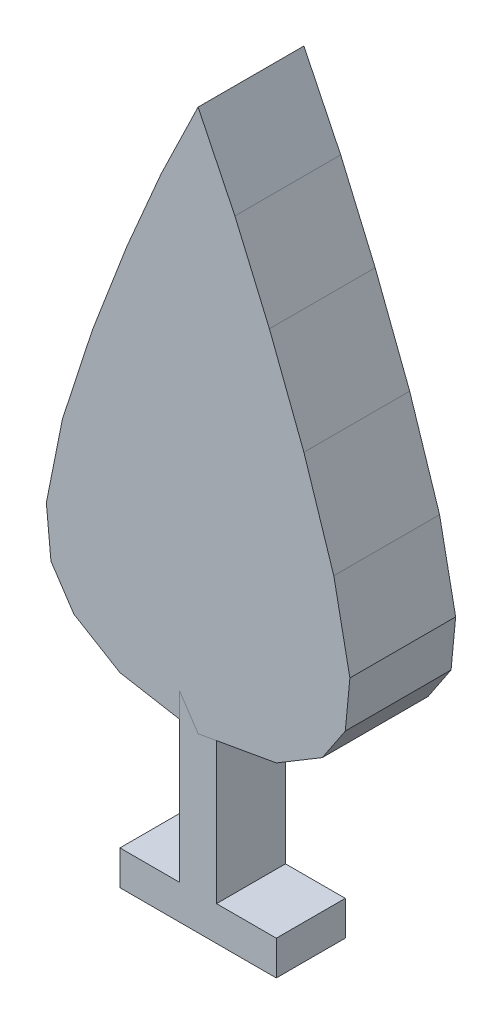
ISO-10303-21;
HEADER;
FILE_DESCRIPTION(('STEP AP214'),'2;1');
FILE_NAME('part.step','',(''),(''),'','','');
FILE_SCHEMA(('AUTOMOTIVE_DESIGN { 1 0 10303 214 1 1 1 1 }'));
ENDSEC;
DATA;
#1=APPLICATION_CONTEXT('core data for automotive mechanical design processes');
#2=APPLICATION_PROTOCOL_DEFINITION('international standard','automotive_design',2000,#1);
#3=PRODUCT_CONTEXT('',#1,'mechanical');
#4=PRODUCT('Part','Part','',(#3));
#5=PRODUCT_RELATED_PRODUCT_CATEGORY('part','',(#4));
#6=PRODUCT_DEFINITION_FORMATION('','',#4);
#7=PRODUCT_DEFINITION_CONTEXT('part definition',#1,'design');
#8=PRODUCT_DEFINITION('design','',#6,#7);
#9=PRODUCT_DEFINITION_SHAPE('','',#8);
#10=(LENGTH_UNIT() NAMED_UNIT(*) SI_UNIT(.MILLI.,.METRE.));
#11=(NAMED_UNIT(*) PLANE_ANGLE_UNIT() SI_UNIT($,.RADIAN.));
#12=(NAMED_UNIT(*) SI_UNIT($,.STERADIAN.) SOLID_ANGLE_UNIT());
#13=UNCERTAINTY_MEASURE_WITH_UNIT(LENGTH_MEASURE(1.E-05),#10,'distance_accuracy_value','');
#14=(GEOMETRIC_REPRESENTATION_CONTEXT(3) GLOBAL_UNCERTAINTY_ASSIGNED_CONTEXT((#13)) GLOBAL_UNIT_ASSIGNED_CONTEXT((#10,
#11,#12)) REPRESENTATION_CONTEXT('',''));
#15=CARTESIAN_POINT('',(0.,0.,0.));
#16=DIRECTION('',(0.,0.,1.));
#17=DIRECTION('',(1.,0.,0.));
#18=AXIS2_PLACEMENT_3D('',#15,#16,#17);
#19=CARTESIAN_POINT('',(-16.,172.,-46.));
#20=DIRECTION('',(-0.8998141071962,0.436273506519369,0.));
#21=DIRECTION('',(-0.436273506519369,-0.8998141071962,0.));
#22=AXIS2_PLACEMENT_3D('',#19,#20,#21);
#23=PLANE('',#22);
#24=DIRECTION('',(-0.436273506519369,-0.899814107196199,0.));
#25=VECTOR('',#24,1.);
#26=CARTESIAN_POINT('',(-16.,172.,0.));
#27=LINE('',#26,#25);
#28=CARTESIAN_POINT('',(0.,205.,0.));
#29=VERTEX_POINT('',#28);
#30=CARTESIAN_POINT('',(-16.,172.,0.));
#31=VERTEX_POINT('',#30);
#32=EDGE_CURVE('E210',#29,#31,#27,.T.);
#33=ORIENTED_EDGE('',*,*,#32,.F.);
#34=DIRECTION('',(0.,0.,1.));
#35=VECTOR('',#34,1.);
#36=CARTESIAN_POINT('',(0.,205.,-46.));
#37=LINE('',#36,#35);
#38=CARTESIAN_POINT('',(0.,205.,-46.));
#39=VERTEX_POINT('',#38);
#40=EDGE_CURVE('E12',#39,#29,#37,.T.);
#41=ORIENTED_EDGE('',*,*,#40,.F.);
#42=DIRECTION('',(-0.436273506519369,-0.899814107196199,0.));
#43=VECTOR('',#42,1.);
#44=CARTESIAN_POINT('',(-16.,172.,-46.));
#45=LINE('',#44,#43);
#46=CARTESIAN_POINT('',(-16.,172.,-46.));
#47=VERTEX_POINT('',#46);
#48=EDGE_CURVE('E260',#39,#47,#45,.T.);
#49=ORIENTED_EDGE('',*,*,#48,.T.);
#50=DIRECTION('',(0.,0.,1.));
#51=VECTOR('',#50,1.);
#52=CARTESIAN_POINT('',(-16.,172.,-46.));
#53=LINE('',#52,#51);
#54=EDGE_CURVE('E56',#47,#31,#53,.T.);
#55=ORIENTED_EDGE('',*,*,#54,.T.);
#56=EDGE_LOOP('',(#33,#41,#49,#55));
#57=FACE_BOUND('',#56,.T.);
#58=ADVANCED_FACE('F53',(#57),#23,.T.);
#59=CARTESIAN_POINT('',(0.,205.,-46.));
#60=DIRECTION('',(0.8998141071962,0.436273506519369,0.));
#61=DIRECTION('',(-0.436273506519369,0.8998141071962,0.));
#62=AXIS2_PLACEMENT_3D('',#59,#60,#61);
#63=PLANE('',#62);
#64=DIRECTION('',(-0.436273506519369,0.899814107196199,0.));
#65=VECTOR('',#64,1.);
#66=CARTESIAN_POINT('',(0.,205.,0.));
#67=LINE('',#66,#65);
#68=CARTESIAN_POINT('',(16.,172.,0.));
#69=VERTEX_POINT('',#68);
#70=EDGE_CURVE('E258',#69,#29,#67,.T.);
#71=ORIENTED_EDGE('',*,*,#70,.F.);
#72=DIRECTION('',(0.,0.,1.));
#73=VECTOR('',#72,1.);
#74=CARTESIAN_POINT('',(16.,172.,-46.));
#75=LINE('',#74,#73);
#76=CARTESIAN_POINT('',(16.,172.,-46.));
#77=VERTEX_POINT('',#76);
#78=EDGE_CURVE('E62',#77,#69,#75,.T.);
#79=ORIENTED_EDGE('',*,*,#78,.F.);
#80=DIRECTION('',(-0.436273506519369,0.899814107196199,0.));
#81=VECTOR('',#80,1.);
#82=CARTESIAN_POINT('',(0.,205.,-46.));
#83=LINE('',#82,#81);
#84=EDGE_CURVE('E200',#77,#39,#83,.T.);
#85=ORIENTED_EDGE('',*,*,#84,.T.);
#86=ORIENTED_EDGE('',*,*,#40,.T.);
#87=EDGE_LOOP('',(#71,#79,#85,#86));
#88=FACE_BOUND('',#87,.T.);
#89=ADVANCED_FACE('F292',(#88),#63,.T.);
#90=CARTESIAN_POINT('',(16.,172.,-46.));
#91=DIRECTION('',(0.919145030018058,0.393919298579168,0.));
#92=DIRECTION('',(-0.393919298579168,0.919145030018058,0.));
#93=AXIS2_PLACEMENT_3D('',#90,#91,#92);
#94=PLANE('',#93);
#95=DIRECTION('',(-0.393919298579168,0.919145030018058,0.));
#96=VECTOR('',#95,1.);
#97=CARTESIAN_POINT('',(16.,172.,0.));
#98=LINE('',#97,#96);
#99=CARTESIAN_POINT('',(31.,137.,0.));
#100=VERTEX_POINT('',#99);
#101=EDGE_CURVE('E187',#100,#69,#98,.T.);
#102=ORIENTED_EDGE('',*,*,#101,.F.);
#103=DIRECTION('',(0.,0.,1.));
#104=VECTOR('',#103,1.);
#105=CARTESIAN_POINT('',(31.,137.,-46.));
#106=LINE('',#105,#104);
#107=CARTESIAN_POINT('',(31.,137.,-46.));
#108=VERTEX_POINT('',#107);
#109=EDGE_CURVE('E182',#108,#100,#106,.T.);
#110=ORIENTED_EDGE('',*,*,#109,.F.);
#111=DIRECTION('',(-0.393919298579168,0.919145030018058,0.));
#112=VECTOR('',#111,1.);
#113=CARTESIAN_POINT('',(16.,172.,-46.));
#114=LINE('',#113,#112);
#115=EDGE_CURVE('E185',#108,#77,#114,.T.);
#116=ORIENTED_EDGE('',*,*,#115,.T.);
#117=ORIENTED_EDGE('',*,*,#78,.T.);
#118=EDGE_LOOP('',(#102,#110,#116,#117));
#119=FACE_BOUND('',#118,.T.);
#120=ADVANCED_FACE('F184',(#119),#94,.T.);
#121=CARTESIAN_POINT('',(31.,137.,-46.));
#122=DIRECTION('',(0.93334560620306,0.358979079308869,0.));
#123=DIRECTION('',(-0.358979079308869,0.93334560620306,0.));
#124=AXIS2_PLACEMENT_3D('',#121,#122,#123);
#125=PLANE('',#124);
#126=DIRECTION('',(-0.358979079308869,0.93334560620306,0.));
#127=VECTOR('',#126,1.);
#128=CARTESIAN_POINT('',(31.,137.,0.));
#129=LINE('',#128,#127);
#130=CARTESIAN_POINT('',(46.,98.,0.));
#131=VERTEX_POINT('',#130);
#132=EDGE_CURVE('E255',#131,#100,#129,.T.);
#133=ORIENTED_EDGE('',*,*,#132,.F.);
#134=DIRECTION('',(0.,0.,1.));
#135=VECTOR('',#134,1.);
#136=CARTESIAN_POINT('',(46.,98.,-46.));
#137=LINE('',#136,#135);
#138=CARTESIAN_POINT('',(46.,98.,-46.));
#139=VERTEX_POINT('',#138);
#140=EDGE_CURVE('E192',#139,#131,#137,.T.);
#141=ORIENTED_EDGE('',*,*,#140,.F.);
#142=DIRECTION('',(-0.358979079308869,0.93334560620306,0.));
#143=VECTOR('',#142,1.);
#144=CARTESIAN_POINT('',(31.,137.,-46.));
#145=LINE('',#144,#143);
#146=EDGE_CURVE('E198',#139,#108,#145,.T.);
#147=ORIENTED_EDGE('',*,*,#146,.T.);
#148=ORIENTED_EDGE('',*,*,#109,.T.);
#149=EDGE_LOOP('',(#133,#141,#147,#148));
#150=FACE_BOUND('',#149,.T.);
#151=ADVANCED_FACE('F202',(#150),#125,.T.);
#152=CARTESIAN_POINT('',(46.,98.,-46.));
#153=DIRECTION('',(0.951034068730948,0.309086072337558,0.));
#154=DIRECTION('',(-0.309086072337558,0.951034068730948,0.));
#155=AXIS2_PLACEMENT_3D('',#152,#153,#154);
#156=PLANE('',#155);
#157=DIRECTION('',(-0.309086072337558,0.951034068730948,0.));
#158=VECTOR('',#157,1.);
#159=CARTESIAN_POINT('',(46.,98.,0.));
#160=LINE('',#159,#158);
#161=CARTESIAN_POINT('',(59.,58.,0.));
#162=VERTEX_POINT('',#161);
#163=EDGE_CURVE('E252',#162,#131,#160,.T.);
#164=ORIENTED_EDGE('',*,*,#163,.F.);
#165=DIRECTION('',(0.,0.,1.));
#166=VECTOR('',#165,1.);
#167=CARTESIAN_POINT('',(59.,58.,-46.));
#168=LINE('',#167,#166);
#169=CARTESIAN_POINT('',(59.,58.,-46.));
#170=VERTEX_POINT('',#169);
#171=EDGE_CURVE('E264',#170,#162,#168,.T.);
#172=ORIENTED_EDGE('',*,*,#171,.F.);
#173=DIRECTION('',(-0.309086072337558,0.951034068730948,0.));
#174=VECTOR('',#173,1.);
#175=CARTESIAN_POINT('',(46.,98.,-46.));
#176=LINE('',#175,#174);
#177=EDGE_CURVE('E203',#170,#139,#176,.T.);
#178=ORIENTED_EDGE('',*,*,#177,.T.);
#179=ORIENTED_EDGE('',*,*,#140,.T.);
#180=EDGE_LOOP('',(#164,#172,#178,#179));
#181=FACE_BOUND('',#180,.T.);
#182=ADVANCED_FACE('F305',(#181),#156,.T.);
#183=CARTESIAN_POINT('',(59.,58.,-46.));
#184=DIRECTION('',(0.98058067569092,0.196116135138184,0.));
#185=DIRECTION('',(-0.196116135138184,0.98058067569092,0.));
#186=AXIS2_PLACEMENT_3D('',#183,#184,#185);
#187=PLANE('',#186);
#188=DIRECTION('',(-0.196116135138184,0.98058067569092,0.));
#189=VECTOR('',#188,1.);
#190=CARTESIAN_POINT('',(59.,58.,0.));
#191=LINE('',#190,#189);
#192=CARTESIAN_POINT('',(66.,23.,0.));
#193=VERTEX_POINT('',#192);
#194=EDGE_CURVE('E249',#193,#162,#191,.T.);
#195=ORIENTED_EDGE('',*,*,#194,.F.);
#196=DIRECTION('',(0.,0.,1.));
#197=VECTOR('',#196,1.);
#198=CARTESIAN_POINT('',(66.,23.,-46.));
#199=LINE('',#198,#197);
#200=CARTESIAN_POINT('',(66.,23.,-46.));
#201=VERTEX_POINT('',#200);
#202=EDGE_CURVE('E266',#201,#193,#199,.T.);
#203=ORIENTED_EDGE('',*,*,#202,.F.);
#204=DIRECTION('',(-0.196116135138184,0.98058067569092,0.));
#205=VECTOR('',#204,1.);
#206=CARTESIAN_POINT('',(59.,58.,-46.));
#207=LINE('',#206,#205);
#208=EDGE_CURVE('E205',#201,#170,#207,.T.);
#209=ORIENTED_EDGE('',*,*,#208,.T.);
#210=ORIENTED_EDGE('',*,*,#171,.T.);
#211=EDGE_LOOP('',(#195,#203,#209,#210));
#212=FACE_BOUND('',#211,.T.);
#213=ADVANCED_FACE('F308',(#212),#187,.T.);
#214=CARTESIAN_POINT('',(66.,23.,-46.));
#215=DIRECTION('',(0.995495472593952,-0.0948090926279955,0.));
#216=DIRECTION('',(0.0948090926279956,0.995495472593952,0.));
#217=AXIS2_PLACEMENT_3D('',#214,#215,#216);
#218=PLANE('',#217);
#219=DIRECTION('',(0.0948090926279955,0.995495472593952,0.));
#220=VECTOR('',#219,1.);
#221=CARTESIAN_POINT('',(66.,23.,0.));
#222=LINE('',#221,#220);
#223=CARTESIAN_POINT('',(64.,2.,0.));
#224=VERTEX_POINT('',#223);
#225=EDGE_CURVE('E246',#224,#193,#222,.T.);
#226=ORIENTED_EDGE('',*,*,#225,.F.);
#227=DIRECTION('',(0.,0.,1.));
#228=VECTOR('',#227,1.);
#229=CARTESIAN_POINT('',(64.,2.,-46.));
#230=LINE('',#229,#228);
#231=CARTESIAN_POINT('',(64.,2.,-46.));
#232=VERTEX_POINT('',#231);
#233=EDGE_CURVE('E268',#232,#224,#230,.T.);
#234=ORIENTED_EDGE('',*,*,#233,.F.);
#235=DIRECTION('',(0.0948090926279955,0.995495472593952,0.));
#236=VECTOR('',#235,1.);
#237=CARTESIAN_POINT('',(66.,23.,-46.));
#238=LINE('',#237,#236);
#239=EDGE_CURVE('E516',#232,#201,#238,.T.);
#240=ORIENTED_EDGE('',*,*,#239,.T.);
#241=ORIENTED_EDGE('',*,*,#202,.T.);
#242=EDGE_LOOP('',(#226,#234,#240,#241));
#243=FACE_BOUND('',#242,.T.);
#244=ADVANCED_FACE('F312',(#243),#218,.T.);
#245=CARTESIAN_POINT('',(64.,2.,-46.));
#246=DIRECTION('',(0.832050294337844,-0.554700196225229,0.));
#247=DIRECTION('',(0.554700196225229,0.832050294337843,0.));
#248=AXIS2_PLACEMENT_3D('',#245,#246,#247);
#249=PLANE('',#248);
#250=DIRECTION('',(0.554700196225229,0.832050294337843,0.));
#251=VECTOR('',#250,1.);
#252=CARTESIAN_POINT('',(64.,2.,0.));
#253=LINE('',#252,#251);
#254=CARTESIAN_POINT('',(54.,-13.,0.));
#255=VERTEX_POINT('',#254);
#256=EDGE_CURVE('E243',#255,#224,#253,.T.);
#257=ORIENTED_EDGE('',*,*,#256,.F.);
#258=DIRECTION('',(0.,0.,1.));
#259=VECTOR('',#258,1.);
#260=CARTESIAN_POINT('',(54.,-13.,-46.));
#261=LINE('',#260,#259);
#262=CARTESIAN_POINT('',(54.,-13.,-46.));
#263=VERTEX_POINT('',#262);
#264=EDGE_CURVE('E270',#263,#255,#261,.T.);
#265=ORIENTED_EDGE('',*,*,#264,.F.);
#266=DIRECTION('',(0.554700196225229,0.832050294337843,0.));
#267=VECTOR('',#266,1.);
#268=CARTESIAN_POINT('',(64.,2.,-46.));
#269=LINE('',#268,#267);
#270=EDGE_CURVE('E520',#263,#232,#269,.T.);
#271=ORIENTED_EDGE('',*,*,#270,.T.);
#272=ORIENTED_EDGE('',*,*,#233,.T.);
#273=EDGE_LOOP('',(#257,#265,#271,#272));
#274=FACE_BOUND('',#273,.T.);
#275=ADVANCED_FACE('F316',(#274),#249,.T.);
#276=CARTESIAN_POINT('',(54.,-13.,-46.));
#277=DIRECTION('',(0.514495755427527,-0.857492925712544,0.));
#278=DIRECTION('',(0.857492925712544,0.514495755427527,0.));
#279=AXIS2_PLACEMENT_3D('',#276,#277,#278);
#280=PLANE('',#279);
#281=DIRECTION('',(0.857492925712544,0.514495755427527,0.));
#282=VECTOR('',#281,1.);
#283=CARTESIAN_POINT('',(54.,-13.,0.));
#284=LINE('',#283,#282);
#285=CARTESIAN_POINT('',(34.,-25.,0.));
#286=VERTEX_POINT('',#285);
#287=EDGE_CURVE('E240',#286,#255,#284,.T.);
#288=ORIENTED_EDGE('',*,*,#287,.F.);
#289=DIRECTION('',(0.,0.,1.));
#290=VECTOR('',#289,1.);
#291=CARTESIAN_POINT('',(34.,-25.,-46.));
#292=LINE('',#291,#290);
#293=CARTESIAN_POINT('',(34.,-25.,-46.));
#294=VERTEX_POINT('',#293);
#295=EDGE_CURVE('E272',#294,#286,#292,.T.);
#296=ORIENTED_EDGE('',*,*,#295,.F.);
#297=DIRECTION('',(0.857492925712544,0.514495755427527,0.));
#298=VECTOR('',#297,1.);
#299=CARTESIAN_POINT('',(54.,-13.,-46.));
#300=LINE('',#299,#298);
#301=EDGE_CURVE('E509',#294,#263,#300,.T.);
#302=ORIENTED_EDGE('',*,*,#301,.T.);
#303=ORIENTED_EDGE('',*,*,#264,.T.);
#304=EDGE_LOOP('',(#288,#296,#302,#303));
#305=FACE_BOUND('',#304,.T.);
#306=ADVANCED_FACE('F320',(#305),#280,.T.);
#307=CARTESIAN_POINT('',(34.,-25.,-46.));
#308=DIRECTION('',(0.173785333909048,-0.984783558817937,0.));
#309=DIRECTION('',(0.984783558817937,0.173785333909048,0.));
#310=AXIS2_PLACEMENT_3D('',#307,#308,#309);
#311=PLANE('',#310);
#312=DIRECTION('',(0.984783558817937,0.173785333909048,0.));
#313=VECTOR('',#312,1.);
#314=CARTESIAN_POINT('',(34.,-25.,0.));
#315=LINE('',#314,#313);
#316=CARTESIAN_POINT('',(0.,-31.,0.));
#317=VERTEX_POINT('',#316);
#318=EDGE_CURVE('E237',#317,#286,#315,.T.);
#319=ORIENTED_EDGE('',*,*,#318,.F.);
#320=DIRECTION('',(0.,0.,1.));
#321=VECTOR('',#320,1.);
#322=CARTESIAN_POINT('',(0.,-31.,-46.));
#323=LINE('',#322,#321);
#324=CARTESIAN_POINT('',(0.,-31.,-46.));
#325=VERTEX_POINT('',#324);
#326=EDGE_CURVE('E274',#325,#317,#323,.T.);
#327=ORIENTED_EDGE('',*,*,#326,.F.);
#328=DIRECTION('',(0.984783558817937,0.173785333909048,0.));
#329=VECTOR('',#328,1.);
#330=CARTESIAN_POINT('',(34.,-25.,-46.));
#331=LINE('',#330,#329);
#332=EDGE_CURVE('E505',#325,#294,#331,.T.);
#333=ORIENTED_EDGE('',*,*,#332,.T.);
#334=ORIENTED_EDGE('',*,*,#295,.T.);
#335=EDGE_LOOP('',(#319,#327,#333,#334));
#336=FACE_BOUND('',#335,.T.);
#337=ADVANCED_FACE('F324',(#336),#311,.T.);
#338=CARTESIAN_POINT('',(0.,-31.,-46.));
#339=DIRECTION('',(-0.173785333909048,-0.984783558817937,0.));
#340=DIRECTION('',(0.984783558817937,-0.173785333909048,0.));
#341=AXIS2_PLACEMENT_3D('',#338,#339,#340);
#342=PLANE('',#341);
#343=DIRECTION('',(0.984783558817937,-0.173785333909048,0.));
#344=VECTOR('',#343,1.);
#345=CARTESIAN_POINT('',(0.,-31.,0.));
#346=LINE('',#345,#344);
#347=CARTESIAN_POINT('',(-34.,-25.,0.));
#348=VERTEX_POINT('',#347);
#349=EDGE_CURVE('E234',#348,#317,#346,.T.);
#350=ORIENTED_EDGE('',*,*,#349,.F.);
#351=DIRECTION('',(0.,0.,1.));
#352=VECTOR('',#351,1.);
#353=CARTESIAN_POINT('',(-34.,-25.,-46.));
#354=LINE('',#353,#352);
#355=CARTESIAN_POINT('',(-34.,-25.,-46.));
#356=VERTEX_POINT('',#355);
#357=EDGE_CURVE('E276',#356,#348,#354,.T.);
#358=ORIENTED_EDGE('',*,*,#357,.F.);
#359=DIRECTION('',(0.984783558817937,-0.173785333909048,0.));
#360=VECTOR('',#359,1.);
#361=CARTESIAN_POINT('',(0.,-31.,-46.));
#362=LINE('',#361,#360);
#363=EDGE_CURVE('E526',#356,#325,#362,.T.);
#364=ORIENTED_EDGE('',*,*,#363,.T.);
#365=ORIENTED_EDGE('',*,*,#326,.T.);
#366=EDGE_LOOP('',(#350,#358,#364,#365));
#367=FACE_BOUND('',#366,.T.);
#368=ADVANCED_FACE('F328',(#367),#342,.T.);
#369=CARTESIAN_POINT('',(-34.,-25.,-46.));
#370=DIRECTION('',(-0.514495755427527,-0.857492925712544,0.));
#371=DIRECTION('',(0.857492925712544,-0.514495755427527,0.));
#372=AXIS2_PLACEMENT_3D('',#369,#370,#371);
#373=PLANE('',#372);
#374=DIRECTION('',(0.857492925712544,-0.514495755427527,0.));
#375=VECTOR('',#374,1.);
#376=CARTESIAN_POINT('',(-34.,-25.,0.));
#377=LINE('',#376,#375);
#378=CARTESIAN_POINT('',(-54.,-13.,0.));
#379=VERTEX_POINT('',#378);
#380=EDGE_CURVE('E231',#379,#348,#377,.T.);
#381=ORIENTED_EDGE('',*,*,#380,.F.);
#382=DIRECTION('',(0.,0.,1.));
#383=VECTOR('',#382,1.);
#384=CARTESIAN_POINT('',(-54.,-13.,-46.));
#385=LINE('',#384,#383);
#386=CARTESIAN_POINT('',(-54.,-13.,-46.));
#387=VERTEX_POINT('',#386);
#388=EDGE_CURVE('E278',#387,#379,#385,.T.);
#389=ORIENTED_EDGE('',*,*,#388,.F.);
#390=DIRECTION('',(0.857492925712544,-0.514495755427527,0.));
#391=VECTOR('',#390,1.);
#392=CARTESIAN_POINT('',(-34.,-25.,-46.));
#393=LINE('',#392,#391);
#394=EDGE_CURVE('E498',#387,#356,#393,.T.);
#395=ORIENTED_EDGE('',*,*,#394,.T.);
#396=ORIENTED_EDGE('',*,*,#357,.T.);
#397=EDGE_LOOP('',(#381,#389,#395,#396));
#398=FACE_BOUND('',#397,.T.);
#399=ADVANCED_FACE('F332',(#398),#373,.T.);
#400=CARTESIAN_POINT('',(-54.,-13.,-46.));
#401=DIRECTION('',(-0.832050294337844,-0.554700196225229,0.));
#402=DIRECTION('',(0.554700196225229,-0.832050294337843,0.));
#403=AXIS2_PLACEMENT_3D('',#400,#401,#402);
#404=PLANE('',#403);
#405=DIRECTION('',(0.554700196225229,-0.832050294337843,0.));
#406=VECTOR('',#405,1.);
#407=CARTESIAN_POINT('',(-54.,-13.,0.));
#408=LINE('',#407,#406);
#409=CARTESIAN_POINT('',(-64.,2.,0.));
#410=VERTEX_POINT('',#409);
#411=EDGE_CURVE('E228',#410,#379,#408,.T.);
#412=ORIENTED_EDGE('',*,*,#411,.F.);
#413=DIRECTION('',(0.,0.,1.));
#414=VECTOR('',#413,1.);
#415=CARTESIAN_POINT('',(-64.,2.,-46.));
#416=LINE('',#415,#414);
#417=CARTESIAN_POINT('',(-64.,2.,-46.));
#418=VERTEX_POINT('',#417);
#419=EDGE_CURVE('E280',#418,#410,#416,.T.);
#420=ORIENTED_EDGE('',*,*,#419,.F.);
#421=DIRECTION('',(0.554700196225229,-0.832050294337843,0.));
#422=VECTOR('',#421,1.);
#423=CARTESIAN_POINT('',(-54.,-13.,-46.));
#424=LINE('',#423,#422);
#425=EDGE_CURVE('E494',#418,#387,#424,.T.);
#426=ORIENTED_EDGE('',*,*,#425,.T.);
#427=ORIENTED_EDGE('',*,*,#388,.T.);
#428=EDGE_LOOP('',(#412,#420,#426,#427));
#429=FACE_BOUND('',#428,.T.);
#430=ADVANCED_FACE('F336',(#429),#404,.T.);
#431=CARTESIAN_POINT('',(-64.,2.,-46.));
#432=DIRECTION('',(-0.995495472593952,-0.0948090926279955,0.));
#433=DIRECTION('',(0.0948090926279956,-0.995495472593952,0.));
#434=AXIS2_PLACEMENT_3D('',#431,#432,#433);
#435=PLANE('',#434);
#436=DIRECTION('',(0.0948090926279955,-0.995495472593952,0.));
#437=VECTOR('',#436,1.);
#438=CARTESIAN_POINT('',(-64.,2.,0.));
#439=LINE('',#438,#437);
#440=CARTESIAN_POINT('',(-66.,23.,0.));
#441=VERTEX_POINT('',#440);
#442=EDGE_CURVE('E225',#441,#410,#439,.T.);
#443=ORIENTED_EDGE('',*,*,#442,.F.);
#444=DIRECTION('',(0.,0.,1.));
#445=VECTOR('',#444,1.);
#446=CARTESIAN_POINT('',(-66.,23.,-46.));
#447=LINE('',#446,#445);
#448=CARTESIAN_POINT('',(-66.,23.,-46.));
#449=VERTEX_POINT('',#448);
#450=EDGE_CURVE('E282',#449,#441,#447,.T.);
#451=ORIENTED_EDGE('',*,*,#450,.F.);
#452=DIRECTION('',(0.0948090926279955,-0.995495472593952,0.));
#453=VECTOR('',#452,1.);
#454=CARTESIAN_POINT('',(-64.,2.,-46.));
#455=LINE('',#454,#453);
#456=EDGE_CURVE('E530',#449,#418,#455,.T.);
#457=ORIENTED_EDGE('',*,*,#456,.T.);
#458=ORIENTED_EDGE('',*,*,#419,.T.);
#459=EDGE_LOOP('',(#443,#451,#457,#458));
#460=FACE_BOUND('',#459,.T.);
#461=ADVANCED_FACE('F340',(#460),#435,.T.);
#462=CARTESIAN_POINT('',(-66.,23.,-46.));
#463=DIRECTION('',(-0.98058067569092,0.196116135138184,0.));
#464=DIRECTION('',(-0.196116135138184,-0.98058067569092,0.));
#465=AXIS2_PLACEMENT_3D('',#462,#463,#464);
#466=PLANE('',#465);
#467=DIRECTION('',(-0.196116135138184,-0.98058067569092,0.));
#468=VECTOR('',#467,1.);
#469=CARTESIAN_POINT('',(-66.,23.,0.));
#470=LINE('',#469,#468);
#471=CARTESIAN_POINT('',(-59.,58.,0.));
#472=VERTEX_POINT('',#471);
#473=EDGE_CURVE('E222',#472,#441,#470,.T.);
#474=ORIENTED_EDGE('',*,*,#473,.F.);
#475=DIRECTION('',(0.,0.,1.));
#476=VECTOR('',#475,1.);
#477=CARTESIAN_POINT('',(-59.,58.,-46.));
#478=LINE('',#477,#476);
#479=CARTESIAN_POINT('',(-59.,58.,-46.));
#480=VERTEX_POINT('',#479);
#481=EDGE_CURVE('E284',#480,#472,#478,.T.);
#482=ORIENTED_EDGE('',*,*,#481,.F.);
#483=DIRECTION('',(-0.196116135138184,-0.98058067569092,0.));
#484=VECTOR('',#483,1.);
#485=CARTESIAN_POINT('',(-66.,23.,-46.));
#486=LINE('',#485,#484);
#487=EDGE_CURVE('E487',#480,#449,#486,.T.);
#488=ORIENTED_EDGE('',*,*,#487,.T.);
#489=ORIENTED_EDGE('',*,*,#450,.T.);
#490=EDGE_LOOP('',(#474,#482,#488,#489));
#491=FACE_BOUND('',#490,.T.);
#492=ADVANCED_FACE('F344',(#491),#466,.T.);
#493=CARTESIAN_POINT('',(-59.,58.,-46.));
#494=DIRECTION('',(-0.951034068730948,0.309086072337558,0.));
#495=DIRECTION('',(-0.309086072337558,-0.951034068730948,0.));
#496=AXIS2_PLACEMENT_3D('',#493,#494,#495);
#497=PLANE('',#496);
#498=DIRECTION('',(-0.309086072337558,-0.951034068730948,0.));
#499=VECTOR('',#498,1.);
#500=CARTESIAN_POINT('',(-59.,58.,0.));
#501=LINE('',#500,#499);
#502=CARTESIAN_POINT('',(-46.,98.,0.));
#503=VERTEX_POINT('',#502);
#504=EDGE_CURVE('E219',#503,#472,#501,.T.);
#505=ORIENTED_EDGE('',*,*,#504,.F.);
#506=DIRECTION('',(0.,0.,1.));
#507=VECTOR('',#506,1.);
#508=CARTESIAN_POINT('',(-46.,98.,-46.));
#509=LINE('',#508,#507);
#510=CARTESIAN_POINT('',(-46.,98.,-46.));
#511=VERTEX_POINT('',#510);
#512=EDGE_CURVE('E286',#511,#503,#509,.T.);
#513=ORIENTED_EDGE('',*,*,#512,.F.);
#514=DIRECTION('',(-0.309086072337558,-0.951034068730948,0.));
#515=VECTOR('',#514,1.);
#516=CARTESIAN_POINT('',(-59.,58.,-46.));
#517=LINE('',#516,#515);
#518=EDGE_CURVE('E483',#511,#480,#517,.T.);
#519=ORIENTED_EDGE('',*,*,#518,.T.);
#520=ORIENTED_EDGE('',*,*,#481,.T.);
#521=EDGE_LOOP('',(#505,#513,#519,#520));
#522=FACE_BOUND('',#521,.T.);
#523=ADVANCED_FACE('F348',(#522),#497,.T.);
#524=CARTESIAN_POINT('',(-46.,98.,-46.));
#525=DIRECTION('',(-0.93334560620306,0.358979079308869,0.));
#526=DIRECTION('',(-0.358979079308869,-0.93334560620306,0.));
#527=AXIS2_PLACEMENT_3D('',#524,#525,#526);
#528=PLANE('',#527);
#529=DIRECTION('',(-0.358979079308869,-0.93334560620306,0.));
#530=VECTOR('',#529,1.);
#531=CARTESIAN_POINT('',(-46.,98.,0.));
#532=LINE('',#531,#530);
#533=CARTESIAN_POINT('',(-31.,137.,0.));
#534=VERTEX_POINT('',#533);
#535=EDGE_CURVE('E216',#534,#503,#532,.T.);
#536=ORIENTED_EDGE('',*,*,#535,.F.);
#537=DIRECTION('',(0.,0.,1.));
#538=VECTOR('',#537,1.);
#539=CARTESIAN_POINT('',(-31.,137.,-46.));
#540=LINE('',#539,#538);
#541=CARTESIAN_POINT('',(-31.,137.,-46.));
#542=VERTEX_POINT('',#541);
#543=EDGE_CURVE('E287',#542,#534,#540,.T.);
#544=ORIENTED_EDGE('',*,*,#543,.F.);
#545=DIRECTION('',(-0.358979079308869,-0.93334560620306,0.));
#546=VECTOR('',#545,1.);
#547=CARTESIAN_POINT('',(-46.,98.,-46.));
#548=LINE('',#547,#546);
#549=EDGE_CURVE('E534',#542,#511,#548,.T.);
#550=ORIENTED_EDGE('',*,*,#549,.T.);
#551=ORIENTED_EDGE('',*,*,#512,.T.);
#552=EDGE_LOOP('',(#536,#544,#550,#551));
#553=FACE_BOUND('',#552,.T.);
#554=ADVANCED_FACE('F352',(#553),#528,.T.);
#555=CARTESIAN_POINT('',(-31.,137.,-46.));
#556=DIRECTION('',(-0.919145030018058,0.393919298579168,0.));
#557=DIRECTION('',(-0.393919298579168,-0.919145030018058,0.));
#558=AXIS2_PLACEMENT_3D('',#555,#556,#557);
#559=PLANE('',#558);
#560=DIRECTION('',(-0.393919298579168,-0.919145030018058,0.));
#561=VECTOR('',#560,1.);
#562=CARTESIAN_POINT('',(-31.,137.,0.));
#563=LINE('',#562,#561);
#564=EDGE_CURVE('E213',#31,#534,#563,.T.);
#565=ORIENTED_EDGE('',*,*,#564,.F.);
#566=ORIENTED_EDGE('',*,*,#54,.F.);
#567=DIRECTION('',(-0.393919298579168,-0.919145030018058,0.));
#568=VECTOR('',#567,1.);
#569=CARTESIAN_POINT('',(-31.,137.,-46.));
#570=LINE('',#569,#568);
#571=EDGE_CURVE('E536',#47,#542,#570,.T.);
#572=ORIENTED_EDGE('',*,*,#571,.T.);
#573=ORIENTED_EDGE('',*,*,#543,.T.);
#574=EDGE_LOOP('',(#565,#566,#572,#573));
#575=FACE_BOUND('',#574,.T.);
#576=ADVANCED_FACE('F289',(#575),#559,.T.);
#577=CARTESIAN_POINT('',(0.,0.,-46.));
#578=DIRECTION('',(0.,0.,1.));
#579=DIRECTION('',(1.,0.,0.));
#580=AXIS2_PLACEMENT_3D('',#577,#578,#579);
#581=PLANE('',#580);
#582=ORIENTED_EDGE('',*,*,#48,.F.);
#583=ORIENTED_EDGE('',*,*,#84,.F.);
#584=ORIENTED_EDGE('',*,*,#115,.F.);
#585=ORIENTED_EDGE('',*,*,#146,.F.);
#586=ORIENTED_EDGE('',*,*,#177,.F.);
#587=ORIENTED_EDGE('',*,*,#208,.F.);
#588=ORIENTED_EDGE('',*,*,#239,.F.);
#589=ORIENTED_EDGE('',*,*,#270,.F.);
#590=ORIENTED_EDGE('',*,*,#301,.F.);
#591=ORIENTED_EDGE('',*,*,#332,.F.);
#592=ORIENTED_EDGE('',*,*,#363,.F.);
#593=ORIENTED_EDGE('',*,*,#394,.F.);
#594=ORIENTED_EDGE('',*,*,#425,.F.);
#595=ORIENTED_EDGE('',*,*,#456,.F.);
#596=ORIENTED_EDGE('',*,*,#487,.F.);
#597=ORIENTED_EDGE('',*,*,#518,.F.);
#598=ORIENTED_EDGE('',*,*,#549,.F.);
#599=ORIENTED_EDGE('',*,*,#571,.F.);
#600=EDGE_LOOP('',(#582,#583,#584,#585,#586,#587,#588,#589,#590,#591,#592,#593,#594,#595,#596,
#597,#598,#599));
#601=FACE_BOUND('',#600,.T.);
#602=ADVANCED_FACE('F196',(#601),#581,.F.);
#603=CARTESIAN_POINT('',(0.,0.,0.));
#604=DIRECTION('',(0.,0.,1.));
#605=DIRECTION('',(1.,0.,0.));
#606=AXIS2_PLACEMENT_3D('',#603,#604,#605);
#607=PLANE('',#606);
#608=ORIENTED_EDGE('',*,*,#32,.T.);
#609=ORIENTED_EDGE('',*,*,#564,.T.);
#610=ORIENTED_EDGE('',*,*,#535,.T.);
#611=ORIENTED_EDGE('',*,*,#504,.T.);
#612=ORIENTED_EDGE('',*,*,#473,.T.);
#613=ORIENTED_EDGE('',*,*,#442,.T.);
#614=ORIENTED_EDGE('',*,*,#411,.T.);
#615=ORIENTED_EDGE('',*,*,#380,.T.);
#616=ORIENTED_EDGE('',*,*,#349,.T.);
#617=ORIENTED_EDGE('',*,*,#318,.T.);
#618=ORIENTED_EDGE('',*,*,#287,.T.);
#619=ORIENTED_EDGE('',*,*,#256,.T.);
#620=ORIENTED_EDGE('',*,*,#225,.T.);
#621=ORIENTED_EDGE('',*,*,#194,.T.);
#622=ORIENTED_EDGE('',*,*,#163,.T.);
#623=ORIENTED_EDGE('',*,*,#132,.T.);
#624=ORIENTED_EDGE('',*,*,#101,.T.);
#625=ORIENTED_EDGE('',*,*,#70,.T.);
#626=EDGE_LOOP('',(#608,#609,#610,#611,#612,#613,#614,#615,#616,#617,#618,#619,#620,#621,#622,
#623,#624,#625));
#627=FACE_BOUND('',#626,.T.);
#628=ADVANCED_FACE('F291',(#627),#607,.T.);
#629=CLOSED_SHELL('',(#58,#89,#120,#151,#182,#213,#244,#275,#306,#337,#368,#399,#430,#461,#492,
#523,#554,#576,#602,#628));
#630=MANIFOLD_SOLID_BREP('B2',#629);
#631=CARTESIAN_POINT('',(8.,-91.,-30.));
#632=DIRECTION('',(1.,0.,0.));
#633=DIRECTION('',(0.,0.,-1.));
#634=AXIS2_PLACEMENT_3D('',#631,#632,#633);
#635=PLANE('',#634);
#636=DIRECTION('',(0.,1.,0.));
#637=VECTOR('',#636,1.);
#638=CARTESIAN_POINT('',(8.,-91.,0.));
#639=LINE('',#638,#637);
#640=CARTESIAN_POINT('',(8.,-91.,0.));
#641=VERTEX_POINT('',#640);
#642=CARTESIAN_POINT('',(8.,1.,0.));
#643=VERTEX_POINT('',#642);
#644=EDGE_CURVE('E637',#641,#643,#639,.T.);
#645=ORIENTED_EDGE('',*,*,#644,.F.);
#646=DIRECTION('',(0.,0.,1.));
#647=VECTOR('',#646,1.);
#648=CARTESIAN_POINT('',(8.,-91.,-30.));
#649=LINE('',#648,#647);
#650=CARTESIAN_POINT('',(8.,-91.,-30.));
#651=VERTEX_POINT('',#650);
#652=EDGE_CURVE('E51',#651,#641,#649,.T.);
#653=ORIENTED_EDGE('',*,*,#652,.F.);
#654=DIRECTION('',(0.,1.,0.));
#655=VECTOR('',#654,1.);
#656=CARTESIAN_POINT('',(8.,-91.,-30.));
#657=LINE('',#656,#655);
#658=CARTESIAN_POINT('',(8.,1.,-30.));
#659=VERTEX_POINT('',#658);
#660=EDGE_CURVE('E646',#651,#659,#657,.T.);
#661=ORIENTED_EDGE('',*,*,#660,.T.);
#662=DIRECTION('',(0.,0.,1.));
#663=VECTOR('',#662,1.);
#664=CARTESIAN_POINT('',(8.,1.,-30.));
#665=LINE('',#664,#663);
#666=EDGE_CURVE('E544',#659,#643,#665,.T.);
#667=ORIENTED_EDGE('',*,*,#666,.T.);
#668=EDGE_LOOP('',(#645,#653,#661,#667));
#669=FACE_BOUND('',#668,.T.);
#670=ADVANCED_FACE('F541',(#669),#635,.T.);
#671=CARTESIAN_POINT('',(-8.,-91.,-30.));
#672=DIRECTION('',(-1.,0.,0.));
#673=DIRECTION('',(0.,0.,1.));
#674=AXIS2_PLACEMENT_3D('',#671,#672,#673);
#675=PLANE('',#674);
#676=DIRECTION('',(0.,-1.,0.));
#677=VECTOR('',#676,1.);
#678=CARTESIAN_POINT('',(-8.,-91.,0.));
#679=LINE('',#678,#677);
#680=CARTESIAN_POINT('',(-8.,1.,0.));
#681=VERTEX_POINT('',#680);
#682=CARTESIAN_POINT('',(-8.,-91.,0.));
#683=VERTEX_POINT('',#682);
#684=EDGE_CURVE('E649',#681,#683,#679,.T.);
#685=ORIENTED_EDGE('',*,*,#684,.F.);
#686=DIRECTION('',(0.,0.,1.));
#687=VECTOR('',#686,1.);
#688=CARTESIAN_POINT('',(-8.,1.,-30.));
#689=LINE('',#688,#687);
#690=CARTESIAN_POINT('',(-8.,1.,-30.));
#691=VERTEX_POINT('',#690);
#692=EDGE_CURVE('E573',#691,#681,#689,.T.);
#693=ORIENTED_EDGE('',*,*,#692,.F.);
#694=DIRECTION('',(0.,-1.,0.));
#695=VECTOR('',#694,1.);
#696=CARTESIAN_POINT('',(-8.,-91.,-30.));
#697=LINE('',#696,#695);
#698=CARTESIAN_POINT('',(-8.,-91.,-30.));
#699=VERTEX_POINT('',#698);
#700=EDGE_CURVE('E651',#691,#699,#697,.T.);
#701=ORIENTED_EDGE('',*,*,#700,.T.);
#702=DIRECTION('',(0.,0.,1.));
#703=VECTOR('',#702,1.);
#704=CARTESIAN_POINT('',(-8.,-91.,-30.));
#705=LINE('',#704,#703);
#706=EDGE_CURVE('E550',#699,#683,#705,.T.);
#707=ORIENTED_EDGE('',*,*,#706,.T.);
#708=EDGE_LOOP('',(#685,#693,#701,#707));
#709=FACE_BOUND('',#708,.T.);
#710=ADVANCED_FACE('F693',(#709),#675,.T.);
#711=CARTESIAN_POINT('',(-8.,1.,-30.));
#712=DIRECTION('',(0.,1.,0.));
#713=DIRECTION('',(0.,0.,1.));
#714=AXIS2_PLACEMENT_3D('',#711,#712,#713);
#715=PLANE('',#714);
#716=DIRECTION('',(-1.,0.,0.));
#717=VECTOR('',#716,1.);
#718=CARTESIAN_POINT('',(-8.,1.,0.));
#719=LINE('',#718,#717);
#720=EDGE_CURVE('E640',#643,#681,#719,.T.);
#721=ORIENTED_EDGE('',*,*,#720,.F.);
#722=ORIENTED_EDGE('',*,*,#666,.F.);
#723=DIRECTION('',(-1.,0.,0.));
#724=VECTOR('',#723,1.);
#725=CARTESIAN_POINT('',(-8.,1.,-30.));
#726=LINE('',#725,#724);
#727=EDGE_CURVE('E648',#659,#691,#726,.T.);
#728=ORIENTED_EDGE('',*,*,#727,.T.);
#729=ORIENTED_EDGE('',*,*,#692,.T.);
#730=EDGE_LOOP('',(#721,#722,#728,#729));
#731=FACE_BOUND('',#730,.T.);
#732=ADVANCED_FACE('F656',(#731),#715,.T.);
#733=CARTESIAN_POINT('',(0.,0.,-30.));
#734=DIRECTION('',(0.,0.,-1.));
#735=DIRECTION('',(-1.,0.,0.));
#736=AXIS2_PLACEMENT_3D('',#733,#734,#735);
#737=PLANE('',#736);
#738=ORIENTED_EDGE('',*,*,#660,.F.);
#739=DIRECTION('',(1.,0.,0.));
#740=VECTOR('',#739,1.);
#741=CARTESIAN_POINT('',(34.,-91.,-30.));
#742=LINE('',#741,#740);
#743=CARTESIAN_POINT('',(34.,-91.,-30.));
#744=VERTEX_POINT('',#743);
#745=EDGE_CURVE('E675',#651,#744,#742,.T.);
#746=ORIENTED_EDGE('',*,*,#745,.T.);
#747=DIRECTION('',(0.,1.,0.));
#748=VECTOR('',#747,1.);
#749=CARTESIAN_POINT('',(34.,-106.,-30.));
#750=LINE('',#749,#748);
#751=CARTESIAN_POINT('',(34.,-106.,-30.));
#752=VERTEX_POINT('',#751);
#753=EDGE_CURVE('E619',#752,#744,#750,.T.);
#754=ORIENTED_EDGE('',*,*,#753,.F.);
#755=DIRECTION('',(1.,0.,0.));
#756=VECTOR('',#755,1.);
#757=CARTESIAN_POINT('',(34.,-106.,-30.));
#758=LINE('',#757,#756);
#759=CARTESIAN_POINT('',(-34.,-106.,-30.));
#760=VERTEX_POINT('',#759);
#761=EDGE_CURVE('E611',#760,#752,#758,.T.);
#762=ORIENTED_EDGE('',*,*,#761,.F.);
#763=DIRECTION('',(0.,1.,0.));
#764=VECTOR('',#763,1.);
#765=CARTESIAN_POINT('',(-34.,-106.,-30.));
#766=LINE('',#765,#764);
#767=CARTESIAN_POINT('',(-34.,-91.,-30.));
#768=VERTEX_POINT('',#767);
#769=EDGE_CURVE('E616',#760,#768,#766,.T.);
#770=ORIENTED_EDGE('',*,*,#769,.T.);
#771=EDGE_CURVE('E676',#768,#699,#742,.T.);
#772=ORIENTED_EDGE('',*,*,#771,.T.);
#773=ORIENTED_EDGE('',*,*,#700,.F.);
#774=ORIENTED_EDGE('',*,*,#727,.F.);
#775=EDGE_LOOP('',(#738,#746,#754,#762,#770,#772,#773,#774));
#776=FACE_BOUND('',#775,.T.);
#777=ADVANCED_FACE('F613',(#776),#737,.T.);
#778=CARTESIAN_POINT('',(0.,0.,0.));
#779=DIRECTION('',(0.,0.,-1.));
#780=DIRECTION('',(-1.,0.,0.));
#781=AXIS2_PLACEMENT_3D('',#778,#779,#780);
#782=PLANE('',#781);
#783=ORIENTED_EDGE('',*,*,#644,.T.);
#784=ORIENTED_EDGE('',*,*,#720,.T.);
#785=ORIENTED_EDGE('',*,*,#684,.T.);
#786=DIRECTION('',(-1.,0.,0.));
#787=VECTOR('',#786,1.);
#788=CARTESIAN_POINT('',(-34.,-91.,0.));
#789=LINE('',#788,#787);
#790=CARTESIAN_POINT('',(-34.,-91.,0.));
#791=VERTEX_POINT('',#790);
#792=EDGE_CURVE('E665',#683,#791,#789,.T.);
#793=ORIENTED_EDGE('',*,*,#792,.T.);
#794=DIRECTION('',(0.,1.,0.));
#795=VECTOR('',#794,1.);
#796=CARTESIAN_POINT('',(-34.,-106.,0.));
#797=LINE('',#796,#795);
#798=CARTESIAN_POINT('',(-34.,-106.,0.));
#799=VERTEX_POINT('',#798);
#800=EDGE_CURVE('E671',#799,#791,#797,.T.);
#801=ORIENTED_EDGE('',*,*,#800,.F.);
#802=DIRECTION('',(-1.,0.,0.));
#803=VECTOR('',#802,1.);
#804=CARTESIAN_POINT('',(-34.,-106.,0.));
#805=LINE('',#804,#803);
#806=CARTESIAN_POINT('',(34.,-106.,0.));
#807=VERTEX_POINT('',#806);
#808=EDGE_CURVE('E628',#807,#799,#805,.T.);
#809=ORIENTED_EDGE('',*,*,#808,.F.);
#810=DIRECTION('',(0.,1.,0.));
#811=VECTOR('',#810,1.);
#812=CARTESIAN_POINT('',(34.,-106.,0.));
#813=LINE('',#812,#811);
#814=CARTESIAN_POINT('',(34.,-91.,0.));
#815=VERTEX_POINT('',#814);
#816=EDGE_CURVE('E642',#807,#815,#813,.T.);
#817=ORIENTED_EDGE('',*,*,#816,.T.);
#818=EDGE_CURVE('E632',#815,#641,#789,.T.);
#819=ORIENTED_EDGE('',*,*,#818,.T.);
#820=EDGE_LOOP('',(#783,#784,#785,#793,#801,#809,#817,#819));
#821=FACE_BOUND('',#820,.T.);
#822=ADVANCED_FACE('F659',(#821),#782,.F.);
#823=CARTESIAN_POINT('',(0.,-91.,0.));
#824=DIRECTION('',(0.,1.,0.));
#825=DIRECTION('',(0.,0.,1.));
#826=AXIS2_PLACEMENT_3D('',#823,#824,#825);
#827=PLANE('',#826);
#828=ORIENTED_EDGE('',*,*,#706,.F.);
#829=ORIENTED_EDGE('',*,*,#771,.F.);
#830=DIRECTION('',(0.,0.,-1.));
#831=VECTOR('',#830,1.);
#832=CARTESIAN_POINT('',(-34.,-91.,-30.));
#833=LINE('',#832,#831);
#834=EDGE_CURVE('E636',#791,#768,#833,.T.);
#835=ORIENTED_EDGE('',*,*,#834,.F.);
#836=ORIENTED_EDGE('',*,*,#792,.F.);
#837=EDGE_LOOP('',(#828,#829,#835,#836));
#838=FACE_BOUND('',#837,.T.);
#839=ADVANCED_FACE('F684',(#838),#827,.T.);
#840=CARTESIAN_POINT('',(-34.,-106.,-30.));
#841=DIRECTION('',(1.,0.,0.));
#842=DIRECTION('',(0.,0.,-1.));
#843=AXIS2_PLACEMENT_3D('',#840,#841,#842);
#844=PLANE('',#843);
#845=ORIENTED_EDGE('',*,*,#834,.T.);
#846=ORIENTED_EDGE('',*,*,#769,.F.);
#847=DIRECTION('',(0.,0.,-1.));
#848=VECTOR('',#847,1.);
#849=CARTESIAN_POINT('',(-34.,-106.,-30.));
#850=LINE('',#849,#848);
#851=EDGE_CURVE('E623',#799,#760,#850,.T.);
#852=ORIENTED_EDGE('',*,*,#851,.F.);
#853=ORIENTED_EDGE('',*,*,#800,.T.);
#854=EDGE_LOOP('',(#845,#846,#852,#853));
#855=FACE_BOUND('',#854,.T.);
#856=ADVANCED_FACE('F634',(#855),#844,.F.);
#857=CARTESIAN_POINT('',(34.,-106.,0.));
#858=DIRECTION('',(-1.,0.,0.));
#859=DIRECTION('',(0.,0.,1.));
#860=AXIS2_PLACEMENT_3D('',#857,#858,#859);
#861=PLANE('',#860);
#862=DIRECTION('',(0.,0.,1.));
#863=VECTOR('',#862,1.);
#864=CARTESIAN_POINT('',(34.,-91.,0.));
#865=LINE('',#864,#863);
#866=EDGE_CURVE('E667',#744,#815,#865,.T.);
#867=ORIENTED_EDGE('',*,*,#866,.T.);
#868=ORIENTED_EDGE('',*,*,#816,.F.);
#869=DIRECTION('',(0.,0.,1.));
#870=VECTOR('',#869,1.);
#871=CARTESIAN_POINT('',(34.,-106.,0.));
#872=LINE('',#871,#870);
#873=EDGE_CURVE('E622',#752,#807,#872,.T.);
#874=ORIENTED_EDGE('',*,*,#873,.F.);
#875=ORIENTED_EDGE('',*,*,#753,.T.);
#876=EDGE_LOOP('',(#867,#868,#874,#875));
#877=FACE_BOUND('',#876,.T.);
#878=ADVANCED_FACE('F680',(#877),#861,.F.);
#879=CARTESIAN_POINT('',(0.,-106.,0.));
#880=DIRECTION('',(0.,1.,0.));
#881=DIRECTION('',(0.,0.,1.));
#882=AXIS2_PLACEMENT_3D('',#879,#880,#881);
#883=PLANE('',#882);
#884=ORIENTED_EDGE('',*,*,#851,.T.);
#885=ORIENTED_EDGE('',*,*,#761,.T.);
#886=ORIENTED_EDGE('',*,*,#873,.T.);
#887=ORIENTED_EDGE('',*,*,#808,.T.);
#888=EDGE_LOOP('',(#884,#885,#886,#887));
#889=FACE_BOUND('',#888,.T.);
#890=ADVANCED_FACE('F626',(#889),#883,.F.);
#891=ORIENTED_EDGE('',*,*,#745,.F.);
#892=ORIENTED_EDGE('',*,*,#652,.T.);
#893=ORIENTED_EDGE('',*,*,#818,.F.);
#894=ORIENTED_EDGE('',*,*,#866,.F.);
#895=EDGE_LOOP('',(#891,#892,#893,#894));
#896=FACE_BOUND('',#895,.T.);
#897=ADVANCED_FACE('F681',(#896),#827,.T.);
#898=CLOSED_SHELL('',(#670,#710,#732,#777,#822,#839,#856,#878,#890,#897));
#899=MANIFOLD_SOLID_BREP('B6',#898);
#900=ADVANCED_BREP_SHAPE_REPRESENTATION('',(#18,#630,#899),#14);
#901=SHAPE_DEFINITION_REPRESENTATION(#9,#900);
ENDSEC;
END-ISO-10303-21;
